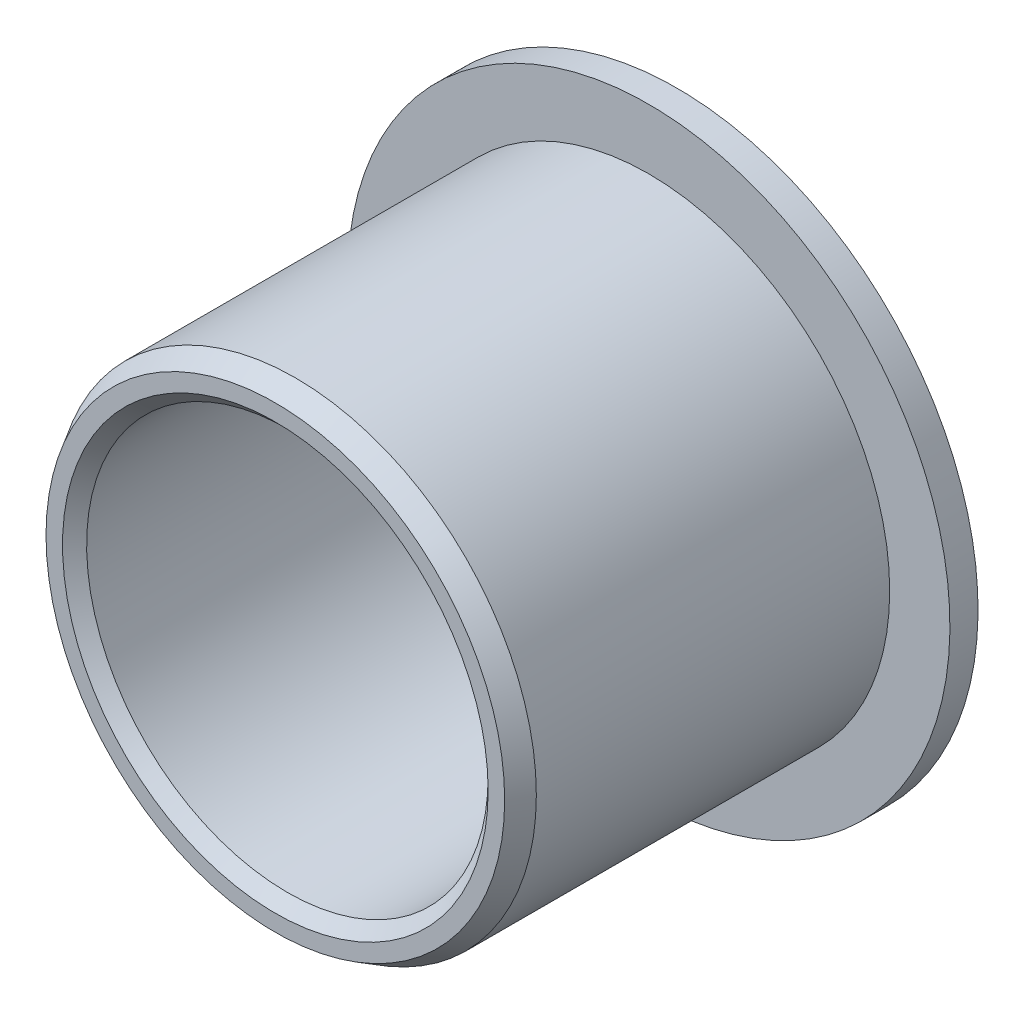
ISO-10303-21;
HEADER;
FILE_DESCRIPTION(('STEP AP214'),'2;1');
FILE_NAME('part.step','',(''),(''),'','','');
FILE_SCHEMA(('AUTOMOTIVE_DESIGN { 1 0 10303 214 1 1 1 1 }'));
ENDSEC;
DATA;
#1=APPLICATION_CONTEXT('core data for automotive mechanical design processes');
#2=APPLICATION_PROTOCOL_DEFINITION('international standard','automotive_design',2000,#1);
#3=PRODUCT_CONTEXT('',#1,'mechanical');
#4=PRODUCT('Part','Part','',(#3));
#5=PRODUCT_RELATED_PRODUCT_CATEGORY('part','',(#4));
#6=PRODUCT_DEFINITION_FORMATION('','',#4);
#7=PRODUCT_DEFINITION_CONTEXT('part definition',#1,'design');
#8=PRODUCT_DEFINITION('design','',#6,#7);
#9=PRODUCT_DEFINITION_SHAPE('','',#8);
#10=(LENGTH_UNIT() NAMED_UNIT(*) SI_UNIT(.MILLI.,.METRE.));
#11=(NAMED_UNIT(*) PLANE_ANGLE_UNIT() SI_UNIT($,.RADIAN.));
#12=(NAMED_UNIT(*) SI_UNIT($,.STERADIAN.) SOLID_ANGLE_UNIT());
#13=UNCERTAINTY_MEASURE_WITH_UNIT(LENGTH_MEASURE(1.E-05),#10,'distance_accuracy_value','');
#14=(GEOMETRIC_REPRESENTATION_CONTEXT(3) GLOBAL_UNCERTAINTY_ASSIGNED_CONTEXT((#13)) GLOBAL_UNIT_ASSIGNED_CONTEXT((#10,
#11,#12)) REPRESENTATION_CONTEXT('',''));
#15=CARTESIAN_POINT('',(0.,0.,0.));
#16=DIRECTION('',(0.,0.,1.));
#17=DIRECTION('',(1.,0.,0.));
#18=AXIS2_PLACEMENT_3D('',#15,#16,#17);
#19=CARTESIAN_POINT('',(0.,0.,0.));
#20=DIRECTION('',(0.,0.,-1.));
#21=DIRECTION('',(0.,1.,0.));
#22=AXIS2_PLACEMENT_3D('',#19,#20,#21);
#23=CONICAL_SURFACE('',#22,5.30000000003383,0.785398163397448);
#24=CARTESIAN_POINT('',(0.,0.,0.));
#25=DIRECTION('',(0.,0.,-1.));
#26=DIRECTION('',(0.,1.,0.));
#27=AXIS2_PLACEMENT_3D('',#24,#25,#26);
#28=CIRCLE('',#27,5.30000000003383);
#29=CARTESIAN_POINT('',(0.,5.30000000003383,0.));
#30=VERTEX_POINT('',#29);
#31=EDGE_CURVE('E17',#30,#30,#28,.F.);
#32=ORIENTED_EDGE('',*,*,#31,.F.);
#33=EDGE_LOOP('',(#32));
#34=FACE_BOUND('',#33,.T.);
#35=CARTESIAN_POINT('',(0.,0.,0.3));
#36=DIRECTION('',(0.,0.,1.));
#37=DIRECTION('',(0.,-1.,0.));
#38=AXIS2_PLACEMENT_3D('',#35,#36,#37);
#39=CIRCLE('',#38,5.);
#40=CARTESIAN_POINT('',(0.,-5.,0.3));
#41=VERTEX_POINT('',#40);
#42=EDGE_CURVE('E33',#41,#41,#39,.T.);
#43=ORIENTED_EDGE('',*,*,#42,.T.);
#44=EDGE_LOOP('',(#43));
#45=FACE_BOUND('',#44,.T.);
#46=ADVANCED_FACE('F14',(#34,#45),#23,.F.);
#47=CARTESIAN_POINT('',(0.,0.,5.));
#48=DIRECTION('',(0.,0.,1.));
#49=DIRECTION('',(0.,-1.,0.));
#50=AXIS2_PLACEMENT_3D('',#47,#48,#49);
#51=CYLINDRICAL_SURFACE('',#50,5.);
#52=ORIENTED_EDGE('',*,*,#42,.F.);
#53=EDGE_LOOP('',(#52));
#54=FACE_BOUND('',#53,.T.);
#55=CARTESIAN_POINT('',(0.,0.,9.70000000000937));
#56=DIRECTION('',(0.,0.,1.));
#57=DIRECTION('',(1.,0.,0.));
#58=AXIS2_PLACEMENT_3D('',#55,#56,#57);
#59=CIRCLE('',#58,4.99999999999545);
#60=CARTESIAN_POINT('',(4.99999999999545,0.,9.70000000000937));
#61=VERTEX_POINT('',#60);
#62=EDGE_CURVE('E29',#61,#61,#59,.T.);
#63=ORIENTED_EDGE('',*,*,#62,.T.);
#64=EDGE_LOOP('',(#63));
#65=FACE_BOUND('',#64,.T.);
#66=ADVANCED_FACE('F51',(#54,#65),#51,.F.);
#67=CARTESIAN_POINT('',(6.4,0.,0.));
#68=DIRECTION('',(0.,0.,-1.));
#69=DIRECTION('',(0.,1.,0.));
#70=AXIS2_PLACEMENT_3D('',#67,#68,#69);
#71=PLANE('',#70);
#72=ORIENTED_EDGE('',*,*,#31,.T.);
#73=EDGE_LOOP('',(#72));
#74=FACE_BOUND('',#73,.T.);
#75=CARTESIAN_POINT('',(0.,0.,0.));
#76=DIRECTION('',(0.,0.,1.));
#77=DIRECTION('',(0.,-1.,0.));
#78=AXIS2_PLACEMENT_3D('',#75,#76,#77);
#79=CIRCLE('',#78,7.5);
#80=CARTESIAN_POINT('',(0.,-7.5,0.));
#81=VERTEX_POINT('',#80);
#82=EDGE_CURVE('E32',#81,#81,#79,.T.);
#83=ORIENTED_EDGE('',*,*,#82,.F.);
#84=EDGE_LOOP('',(#83));
#85=FACE_BOUND('',#84,.T.);
#86=ADVANCED_FACE('F48',(#74,#85),#71,.T.);
#87=CARTESIAN_POINT('',(0.,0.,10.0000000000477));
#88=DIRECTION('',(0.,0.,1.));
#89=DIRECTION('',(1.,0.,0.));
#90=AXIS2_PLACEMENT_3D('',#87,#88,#89);
#91=CONICAL_SURFACE('',#90,5.30000000003383,0.785398163302709);
#92=ORIENTED_EDGE('',*,*,#62,.F.);
#93=EDGE_LOOP('',(#92));
#94=FACE_BOUND('',#93,.T.);
#95=CARTESIAN_POINT('',(0.,0.,9.99999999999091));
#96=DIRECTION('',(0.,0.,1.));
#97=DIRECTION('',(1.,0.,0.));
#98=AXIS2_PLACEMENT_3D('',#95,#96,#97);
#99=CIRCLE('',#98,5.29999999997699);
#100=CARTESIAN_POINT('',(5.29999999997699,0.,9.99999999999091));
#101=VERTEX_POINT('',#100);
#102=EDGE_CURVE('E41',#101,#101,#99,.F.);
#103=ORIENTED_EDGE('',*,*,#102,.F.);
#104=EDGE_LOOP('',(#103));
#105=FACE_BOUND('',#104,.T.);
#106=ADVANCED_FACE('F50',(#94,#105),#91,.F.);
#107=CARTESIAN_POINT('',(0.,0.,0.35));
#108=DIRECTION('',(0.,0.,1.));
#109=DIRECTION('',(0.,-1.,0.));
#110=AXIS2_PLACEMENT_3D('',#107,#108,#109);
#111=CYLINDRICAL_SURFACE('',#110,7.5);
#112=CARTESIAN_POINT('',(0.,0.,0.7));
#113=DIRECTION('',(0.,0.,1.));
#114=DIRECTION('',(0.,-1.,0.));
#115=AXIS2_PLACEMENT_3D('',#112,#113,#114);
#116=CIRCLE('',#115,7.5);
#117=CARTESIAN_POINT('',(0.,-7.5,0.7));
#118=VERTEX_POINT('',#117);
#119=EDGE_CURVE('E38',#118,#118,#116,.T.);
#120=ORIENTED_EDGE('',*,*,#119,.F.);
#121=EDGE_LOOP('',(#120));
#122=FACE_BOUND('',#121,.T.);
#123=ORIENTED_EDGE('',*,*,#82,.T.);
#124=EDGE_LOOP('',(#123));
#125=FACE_BOUND('',#124,.T.);
#126=ADVANCED_FACE('F46',(#122,#125),#111,.T.);
#127=CARTESIAN_POINT('',(5.50566243270259,0.,10.));
#128=DIRECTION('',(0.,0.,1.));
#129=DIRECTION('',(0.,-1.,0.));
#130=AXIS2_PLACEMENT_3D('',#127,#128,#129);
#131=PLANE('',#130);
#132=CARTESIAN_POINT('',(0.,0.,9.99999999999091));
#133=DIRECTION('',(0.,0.,-1.));
#134=DIRECTION('',(-1.,0.,0.));
#135=AXIS2_PLACEMENT_3D('',#132,#133,#134);
#136=CIRCLE('',#135,5.71132486538772);
#137=CARTESIAN_POINT('',(-5.71132486538772,0.,9.99999999999091));
#138=VERTEX_POINT('',#137);
#139=EDGE_CURVE('E26',#138,#138,#136,.T.);
#140=ORIENTED_EDGE('',*,*,#139,.F.);
#141=EDGE_LOOP('',(#140));
#142=FACE_BOUND('',#141,.T.);
#143=ORIENTED_EDGE('',*,*,#102,.T.);
#144=EDGE_LOOP('',(#143));
#145=FACE_BOUND('',#144,.T.);
#146=ADVANCED_FACE('F77',(#142,#145),#131,.T.);
#147=CARTESIAN_POINT('',(6.75,0.,0.7));
#148=DIRECTION('',(0.,0.,1.));
#149=DIRECTION('',(0.,-1.,0.));
#150=AXIS2_PLACEMENT_3D('',#147,#148,#149);
#151=PLANE('',#150);
#152=ORIENTED_EDGE('',*,*,#119,.T.);
#153=EDGE_LOOP('',(#152));
#154=FACE_BOUND('',#153,.T.);
#155=CARTESIAN_POINT('',(0.,0.,0.7));
#156=DIRECTION('',(0.,0.,1.));
#157=DIRECTION('',(0.,-1.,0.));
#158=AXIS2_PLACEMENT_3D('',#155,#156,#157);
#159=CIRCLE('',#158,6.);
#160=CARTESIAN_POINT('',(0.,-6.,0.7));
#161=VERTEX_POINT('',#160);
#162=EDGE_CURVE('E21',#161,#161,#159,.T.);
#163=ORIENTED_EDGE('',*,*,#162,.F.);
#164=EDGE_LOOP('',(#163));
#165=FACE_BOUND('',#164,.T.);
#166=ADVANCED_FACE('F71',(#154,#165),#151,.T.);
#167=CARTESIAN_POINT('',(0.,0.,9.50000000000273));
#168=DIRECTION('',(0.,0.,-1.));
#169=DIRECTION('',(-1.,0.,0.));
#170=AXIS2_PLACEMENT_3D('',#167,#168,#169);
#171=CONICAL_SURFACE('',#170,5.99999999997181,0.523598775592442);
#172=ORIENTED_EDGE('',*,*,#139,.T.);
#173=EDGE_LOOP('',(#172));
#174=FACE_BOUND('',#173,.T.);
#175=CARTESIAN_POINT('',(0.,0.,9.5));
#176=DIRECTION('',(0.,0.,1.));
#177=DIRECTION('',(0.,-1.,0.));
#178=AXIS2_PLACEMENT_3D('',#175,#176,#177);
#179=CIRCLE('',#178,6.);
#180=CARTESIAN_POINT('',(0.,-6.,9.5));
#181=VERTEX_POINT('',#180);
#182=EDGE_CURVE('E10',#181,#181,#179,.F.);
#183=ORIENTED_EDGE('',*,*,#182,.F.);
#184=EDGE_LOOP('',(#183));
#185=FACE_BOUND('',#184,.T.);
#186=ADVANCED_FACE('F65',(#174,#185),#171,.T.);
#187=CARTESIAN_POINT('',(0.,0.,5.1));
#188=DIRECTION('',(0.,0.,1.));
#189=DIRECTION('',(0.,-1.,0.));
#190=AXIS2_PLACEMENT_3D('',#187,#188,#189);
#191=CYLINDRICAL_SURFACE('',#190,6.);
#192=ORIENTED_EDGE('',*,*,#162,.T.);
#193=EDGE_LOOP('',(#192));
#194=FACE_BOUND('',#193,.T.);
#195=ORIENTED_EDGE('',*,*,#182,.T.);
#196=EDGE_LOOP('',(#195));
#197=FACE_BOUND('',#196,.T.);
#198=ADVANCED_FACE('F63',(#194,#197),#191,.T.);
#199=CLOSED_SHELL('',(#46,#66,#86,#106,#126,#146,#166,#186,#198));
#200=MANIFOLD_SOLID_BREP('B1',#199);
#201=ADVANCED_BREP_SHAPE_REPRESENTATION('',(#18,#200),#14);
#202=SHAPE_DEFINITION_REPRESENTATION(#9,#201);
ENDSEC;
END-ISO-10303-21;
